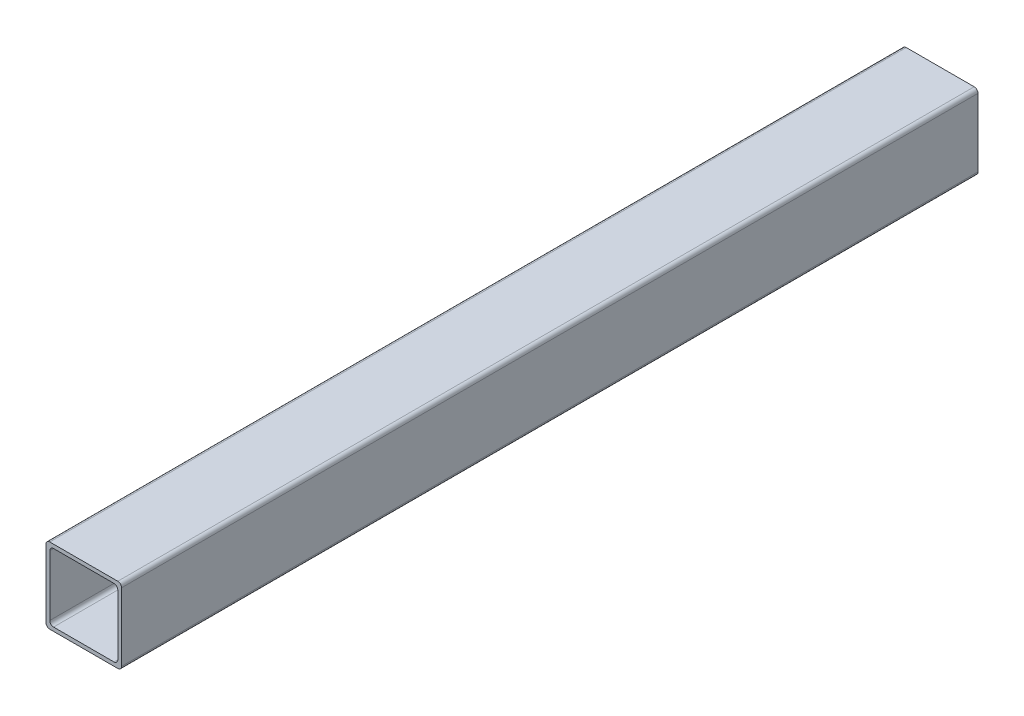
ISO-10303-21;
HEADER;
FILE_DESCRIPTION(('STEP AP214'),'2;1');
FILE_NAME('part.step','',(''),(''),'','','');
FILE_SCHEMA(('AUTOMOTIVE_DESIGN { 1 0 10303 214 1 1 1 1 }'));
ENDSEC;
DATA;
#1=APPLICATION_CONTEXT('core data for automotive mechanical design processes');
#2=APPLICATION_PROTOCOL_DEFINITION('international standard','automotive_design',2000,#1);
#3=PRODUCT_CONTEXT('',#1,'mechanical');
#4=PRODUCT('Part','Part','',(#3));
#5=PRODUCT_RELATED_PRODUCT_CATEGORY('part','',(#4));
#6=PRODUCT_DEFINITION_FORMATION('','',#4);
#7=PRODUCT_DEFINITION_CONTEXT('part definition',#1,'design');
#8=PRODUCT_DEFINITION('design','',#6,#7);
#9=PRODUCT_DEFINITION_SHAPE('','',#8);
#10=(LENGTH_UNIT() NAMED_UNIT(*) SI_UNIT(.MILLI.,.METRE.));
#11=(NAMED_UNIT(*) PLANE_ANGLE_UNIT() SI_UNIT($,.RADIAN.));
#12=(NAMED_UNIT(*) SI_UNIT($,.STERADIAN.) SOLID_ANGLE_UNIT());
#13=UNCERTAINTY_MEASURE_WITH_UNIT(LENGTH_MEASURE(1.E-05),#10,'distance_accuracy_value','');
#14=(GEOMETRIC_REPRESENTATION_CONTEXT(3) GLOBAL_UNCERTAINTY_ASSIGNED_CONTEXT((#13)) GLOBAL_UNIT_ASSIGNED_CONTEXT((#10,
#11,#12)) REPRESENTATION_CONTEXT('',''));
#15=CARTESIAN_POINT('',(0.,0.,0.));
#16=DIRECTION('',(0.,0.,1.));
#17=DIRECTION('',(1.,0.,0.));
#18=AXIS2_PLACEMENT_3D('',#15,#16,#17);
#19=CARTESIAN_POINT('',(3.,0.,680.));
#20=DIRECTION('',(-1.,0.,0.));
#21=DIRECTION('',(0.,0.,1.));
#22=AXIS2_PLACEMENT_3D('',#19,#20,#21);
#23=PLANE('',#22);
#24=DIRECTION('',(0.,1.,0.));
#25=VECTOR('',#24,1.);
#26=CARTESIAN_POINT('',(3.,0.,0.));
#27=LINE('',#26,#25);
#28=CARTESIAN_POINT('',(3.,6.00000000000002,0.));
#29=VERTEX_POINT('',#28);
#30=CARTESIAN_POINT('',(3.,54.,0.));
#31=VERTEX_POINT('',#30);
#32=EDGE_CURVE('E203',#29,#31,#27,.T.);
#33=ORIENTED_EDGE('',*,*,#32,.T.);
#34=DIRECTION('',(0.,0.,-1.));
#35=VECTOR('',#34,1.);
#36=CARTESIAN_POINT('',(3.,54.,680.));
#37=LINE('',#36,#35);
#38=CARTESIAN_POINT('',(3.,54.,680.));
#39=VERTEX_POINT('',#38);
#40=EDGE_CURVE('E11',#39,#31,#37,.T.);
#41=ORIENTED_EDGE('',*,*,#40,.F.);
#42=DIRECTION('',(0.,1.,0.));
#43=VECTOR('',#42,1.);
#44=CARTESIAN_POINT('',(3.,0.,680.));
#45=LINE('',#44,#43);
#46=CARTESIAN_POINT('',(3.,6.00000000000002,680.));
#47=VERTEX_POINT('',#46);
#48=EDGE_CURVE('E285',#47,#39,#45,.T.);
#49=ORIENTED_EDGE('',*,*,#48,.F.);
#50=DIRECTION('',(0.,0.,-1.));
#51=VECTOR('',#50,1.);
#52=CARTESIAN_POINT('',(3.,6.00000000000002,680.));
#53=LINE('',#52,#51);
#54=EDGE_CURVE('E51',#47,#29,#53,.T.);
#55=ORIENTED_EDGE('',*,*,#54,.T.);
#56=EDGE_LOOP('',(#33,#41,#49,#55));
#57=FACE_BOUND('',#56,.T.);
#58=ADVANCED_FACE('F32',(#57),#23,.F.);
#59=CARTESIAN_POINT('',(6.,54.,680.));
#60=DIRECTION('',(0.,0.,-1.));
#61=DIRECTION('',(-1.,0.,0.));
#62=AXIS2_PLACEMENT_3D('',#59,#60,#61);
#63=CYLINDRICAL_SURFACE('',#62,3.);
#64=CARTESIAN_POINT('',(6.,54.,0.));
#65=DIRECTION('',(0.,0.,1.));
#66=DIRECTION('',(1.,0.,0.));
#67=AXIS2_PLACEMENT_3D('',#64,#65,#66);
#68=CIRCLE('',#67,3.);
#69=CARTESIAN_POINT('',(6.00000000000002,57.,0.));
#70=VERTEX_POINT('',#69);
#71=EDGE_CURVE('E205',#31,#70,#68,.F.);
#72=ORIENTED_EDGE('',*,*,#71,.T.);
#73=DIRECTION('',(0.,0.,-1.));
#74=VECTOR('',#73,1.);
#75=CARTESIAN_POINT('',(6.00000000000002,57.,680.));
#76=LINE('',#75,#74);
#77=CARTESIAN_POINT('',(6.00000000000002,57.,680.));
#78=VERTEX_POINT('',#77);
#79=EDGE_CURVE('E42',#78,#70,#76,.T.);
#80=ORIENTED_EDGE('',*,*,#79,.F.);
#81=CARTESIAN_POINT('',(6.,54.,680.));
#82=DIRECTION('',(0.,0.,1.));
#83=DIRECTION('',(1.,0.,0.));
#84=AXIS2_PLACEMENT_3D('',#81,#82,#83);
#85=CIRCLE('',#84,3.);
#86=EDGE_CURVE('E287',#39,#78,#85,.F.);
#87=ORIENTED_EDGE('',*,*,#86,.F.);
#88=ORIENTED_EDGE('',*,*,#40,.T.);
#89=EDGE_LOOP('',(#72,#80,#87,#88));
#90=FACE_BOUND('',#89,.T.);
#91=ADVANCED_FACE('F312',(#90),#63,.F.);
#92=CARTESIAN_POINT('',(0.,57.,680.));
#93=DIRECTION('',(0.,1.,0.));
#94=DIRECTION('',(0.,0.,1.));
#95=AXIS2_PLACEMENT_3D('',#92,#93,#94);
#96=PLANE('',#95);
#97=DIRECTION('',(1.,0.,0.));
#98=VECTOR('',#97,1.);
#99=CARTESIAN_POINT('',(0.,57.,0.));
#100=LINE('',#99,#98);
#101=CARTESIAN_POINT('',(54.,57.,0.));
#102=VERTEX_POINT('',#101);
#103=EDGE_CURVE('E207',#70,#102,#100,.T.);
#104=ORIENTED_EDGE('',*,*,#103,.T.);
#105=DIRECTION('',(0.,0.,-1.));
#106=VECTOR('',#105,1.);
#107=CARTESIAN_POINT('',(54.,57.,680.));
#108=LINE('',#107,#106);
#109=CARTESIAN_POINT('',(54.,57.,680.));
#110=VERTEX_POINT('',#109);
#111=EDGE_CURVE('E227',#110,#102,#108,.T.);
#112=ORIENTED_EDGE('',*,*,#111,.F.);
#113=DIRECTION('',(1.,0.,0.));
#114=VECTOR('',#113,1.);
#115=CARTESIAN_POINT('',(0.,57.,680.));
#116=LINE('',#115,#114);
#117=EDGE_CURVE('E289',#78,#110,#116,.T.);
#118=ORIENTED_EDGE('',*,*,#117,.F.);
#119=ORIENTED_EDGE('',*,*,#79,.T.);
#120=EDGE_LOOP('',(#104,#112,#118,#119));
#121=FACE_BOUND('',#120,.T.);
#122=ADVANCED_FACE('F317',(#121),#96,.F.);
#123=CARTESIAN_POINT('',(54.,54.,680.));
#124=DIRECTION('',(0.,0.,-1.));
#125=DIRECTION('',(-1.,0.,0.));
#126=AXIS2_PLACEMENT_3D('',#123,#124,#125);
#127=CYLINDRICAL_SURFACE('',#126,3.);
#128=CARTESIAN_POINT('',(54.,54.,0.));
#129=DIRECTION('',(0.,0.,1.));
#130=DIRECTION('',(1.,0.,0.));
#131=AXIS2_PLACEMENT_3D('',#128,#129,#130);
#132=CIRCLE('',#131,3.);
#133=CARTESIAN_POINT('',(57.,54.,0.));
#134=VERTEX_POINT('',#133);
#135=EDGE_CURVE('E209',#102,#134,#132,.F.);
#136=ORIENTED_EDGE('',*,*,#135,.T.);
#137=DIRECTION('',(0.,0.,-1.));
#138=VECTOR('',#137,1.);
#139=CARTESIAN_POINT('',(57.,54.,680.));
#140=LINE('',#139,#138);
#141=CARTESIAN_POINT('',(57.,54.,680.));
#142=VERTEX_POINT('',#141);
#143=EDGE_CURVE('E225',#142,#134,#140,.T.);
#144=ORIENTED_EDGE('',*,*,#143,.F.);
#145=CARTESIAN_POINT('',(54.,54.,680.));
#146=DIRECTION('',(0.,0.,1.));
#147=DIRECTION('',(1.,0.,0.));
#148=AXIS2_PLACEMENT_3D('',#145,#146,#147);
#149=CIRCLE('',#148,3.);
#150=EDGE_CURVE('E291',#110,#142,#149,.F.);
#151=ORIENTED_EDGE('',*,*,#150,.F.);
#152=ORIENTED_EDGE('',*,*,#111,.T.);
#153=EDGE_LOOP('',(#136,#144,#151,#152));
#154=FACE_BOUND('',#153,.T.);
#155=ADVANCED_FACE('F350',(#154),#127,.F.);
#156=CARTESIAN_POINT('',(57.,0.,680.));
#157=DIRECTION('',(-1.,0.,0.));
#158=DIRECTION('',(0.,0.,1.));
#159=AXIS2_PLACEMENT_3D('',#156,#157,#158);
#160=PLANE('',#159);
#161=DIRECTION('',(0.,1.,0.));
#162=VECTOR('',#161,1.);
#163=CARTESIAN_POINT('',(57.,0.,0.));
#164=LINE('',#163,#162);
#165=CARTESIAN_POINT('',(57.,6.00000000000002,0.));
#166=VERTEX_POINT('',#165);
#167=EDGE_CURVE('E212',#166,#134,#164,.T.);
#168=ORIENTED_EDGE('',*,*,#167,.F.);
#169=DIRECTION('',(0.,0.,-1.));
#170=VECTOR('',#169,1.);
#171=CARTESIAN_POINT('',(57.,6.00000000000002,680.));
#172=LINE('',#171,#170);
#173=CARTESIAN_POINT('',(57.,6.00000000000002,680.));
#174=VERTEX_POINT('',#173);
#175=EDGE_CURVE('E172',#174,#166,#172,.T.);
#176=ORIENTED_EDGE('',*,*,#175,.F.);
#177=DIRECTION('',(0.,1.,0.));
#178=VECTOR('',#177,1.);
#179=CARTESIAN_POINT('',(57.,0.,680.));
#180=LINE('',#179,#178);
#181=EDGE_CURVE('E162',#174,#142,#180,.T.);
#182=ORIENTED_EDGE('',*,*,#181,.T.);
#183=ORIENTED_EDGE('',*,*,#143,.T.);
#184=EDGE_LOOP('',(#168,#176,#182,#183));
#185=FACE_BOUND('',#184,.T.);
#186=ADVANCED_FACE('F294',(#185),#160,.T.);
#187=CARTESIAN_POINT('',(54.,6.,680.));
#188=DIRECTION('',(0.,0.,-1.));
#189=DIRECTION('',(-1.,0.,0.));
#190=AXIS2_PLACEMENT_3D('',#187,#188,#189);
#191=CYLINDRICAL_SURFACE('',#190,3.);
#192=CARTESIAN_POINT('',(54.,6.,0.));
#193=DIRECTION('',(0.,0.,1.));
#194=DIRECTION('',(1.,0.,0.));
#195=AXIS2_PLACEMENT_3D('',#192,#193,#194);
#196=CIRCLE('',#195,3.);
#197=CARTESIAN_POINT('',(54.,3.,0.));
#198=VERTEX_POINT('',#197);
#199=EDGE_CURVE('E169',#166,#198,#196,.F.);
#200=ORIENTED_EDGE('',*,*,#199,.T.);
#201=DIRECTION('',(0.,0.,-1.));
#202=VECTOR('',#201,1.);
#203=CARTESIAN_POINT('',(54.,3.,680.));
#204=LINE('',#203,#202);
#205=CARTESIAN_POINT('',(54.,3.,680.));
#206=VERTEX_POINT('',#205);
#207=EDGE_CURVE('E166',#206,#198,#204,.T.);
#208=ORIENTED_EDGE('',*,*,#207,.F.);
#209=CARTESIAN_POINT('',(54.,6.,680.));
#210=DIRECTION('',(0.,0.,1.));
#211=DIRECTION('',(1.,0.,0.));
#212=AXIS2_PLACEMENT_3D('',#209,#210,#211);
#213=CIRCLE('',#212,3.);
#214=EDGE_CURVE('E154',#174,#206,#213,.F.);
#215=ORIENTED_EDGE('',*,*,#214,.F.);
#216=ORIENTED_EDGE('',*,*,#175,.T.);
#217=EDGE_LOOP('',(#200,#208,#215,#216));
#218=FACE_BOUND('',#217,.T.);
#219=ADVANCED_FACE('F167',(#218),#191,.F.);
#220=CARTESIAN_POINT('',(0.,3.,680.));
#221=DIRECTION('',(0.,1.,0.));
#222=DIRECTION('',(0.,0.,1.));
#223=AXIS2_PLACEMENT_3D('',#220,#221,#222);
#224=PLANE('',#223);
#225=DIRECTION('',(1.,0.,0.));
#226=VECTOR('',#225,1.);
#227=CARTESIAN_POINT('',(0.,3.,0.));
#228=LINE('',#227,#226);
#229=CARTESIAN_POINT('',(6.00000000000002,3.,0.));
#230=VERTEX_POINT('',#229);
#231=EDGE_CURVE('E216',#230,#198,#228,.T.);
#232=ORIENTED_EDGE('',*,*,#231,.F.);
#233=DIRECTION('',(0.,0.,-1.));
#234=VECTOR('',#233,1.);
#235=CARTESIAN_POINT('',(6.00000000000002,3.,680.));
#236=LINE('',#235,#234);
#237=CARTESIAN_POINT('',(6.00000000000002,3.,680.));
#238=VERTEX_POINT('',#237);
#239=EDGE_CURVE('E101',#238,#230,#236,.T.);
#240=ORIENTED_EDGE('',*,*,#239,.F.);
#241=DIRECTION('',(1.,0.,0.));
#242=VECTOR('',#241,1.);
#243=CARTESIAN_POINT('',(0.,3.,680.));
#244=LINE('',#243,#242);
#245=EDGE_CURVE('E160',#238,#206,#244,.T.);
#246=ORIENTED_EDGE('',*,*,#245,.T.);
#247=ORIENTED_EDGE('',*,*,#207,.T.);
#248=EDGE_LOOP('',(#232,#240,#246,#247));
#249=FACE_BOUND('',#248,.T.);
#250=ADVANCED_FACE('F174',(#249),#224,.T.);
#251=CARTESIAN_POINT('',(3.,57.,680.));
#252=DIRECTION('',(0.,0.,-1.));
#253=DIRECTION('',(-1.,0.,0.));
#254=AXIS2_PLACEMENT_3D('',#251,#252,#253);
#255=CYLINDRICAL_SURFACE('',#254,3.);
#256=CARTESIAN_POINT('',(3.,57.,0.));
#257=DIRECTION('',(0.,0.,1.));
#258=DIRECTION('',(1.,0.,0.));
#259=AXIS2_PLACEMENT_3D('',#256,#257,#258);
#260=CIRCLE('',#259,3.);
#261=CARTESIAN_POINT('',(0.,57.,0.));
#262=VERTEX_POINT('',#261);
#263=CARTESIAN_POINT('',(3.00000000000002,60.,0.));
#264=VERTEX_POINT('',#263);
#265=EDGE_CURVE('E181',#262,#264,#260,.F.);
#266=ORIENTED_EDGE('',*,*,#265,.F.);
#267=DIRECTION('',(0.,0.,-1.));
#268=VECTOR('',#267,1.);
#269=CARTESIAN_POINT('',(0.,57.,680.));
#270=LINE('',#269,#268);
#271=CARTESIAN_POINT('',(0.,57.,680.));
#272=VERTEX_POINT('',#271);
#273=EDGE_CURVE('E36',#272,#262,#270,.T.);
#274=ORIENTED_EDGE('',*,*,#273,.F.);
#275=CARTESIAN_POINT('',(3.,57.,680.));
#276=DIRECTION('',(0.,0.,1.));
#277=DIRECTION('',(1.,0.,0.));
#278=AXIS2_PLACEMENT_3D('',#275,#276,#277);
#279=CIRCLE('',#278,3.);
#280=CARTESIAN_POINT('',(3.00000000000002,60.,680.));
#281=VERTEX_POINT('',#280);
#282=EDGE_CURVE('E221',#272,#281,#279,.F.);
#283=ORIENTED_EDGE('',*,*,#282,.T.);
#284=DIRECTION('',(0.,0.,-1.));
#285=VECTOR('',#284,1.);
#286=CARTESIAN_POINT('',(3.00000000000002,60.,680.));
#287=LINE('',#286,#285);
#288=EDGE_CURVE('E177',#281,#264,#287,.T.);
#289=ORIENTED_EDGE('',*,*,#288,.T.);
#290=EDGE_LOOP('',(#266,#274,#283,#289));
#291=FACE_BOUND('',#290,.T.);
#292=ADVANCED_FACE('F34',(#291),#255,.T.);
#293=CARTESIAN_POINT('',(0.,0.,680.));
#294=DIRECTION('',(-1.,0.,0.));
#295=DIRECTION('',(0.,0.,1.));
#296=AXIS2_PLACEMENT_3D('',#293,#294,#295);
#297=PLANE('',#296);
#298=DIRECTION('',(0.,1.,0.));
#299=VECTOR('',#298,1.);
#300=CARTESIAN_POINT('',(0.,0.,0.));
#301=LINE('',#300,#299);
#302=CARTESIAN_POINT('',(0.,3.00000000000002,0.));
#303=VERTEX_POINT('',#302);
#304=EDGE_CURVE('E184',#303,#262,#301,.T.);
#305=ORIENTED_EDGE('',*,*,#304,.F.);
#306=DIRECTION('',(0.,0.,-1.));
#307=VECTOR('',#306,1.);
#308=CARTESIAN_POINT('',(0.,3.00000000000002,680.));
#309=LINE('',#308,#307);
#310=CARTESIAN_POINT('',(0.,3.00000000000002,680.));
#311=VERTEX_POINT('',#310);
#312=EDGE_CURVE('E244',#311,#303,#309,.T.);
#313=ORIENTED_EDGE('',*,*,#312,.F.);
#314=DIRECTION('',(0.,1.,0.));
#315=VECTOR('',#314,1.);
#316=CARTESIAN_POINT('',(0.,0.,680.));
#317=LINE('',#316,#315);
#318=EDGE_CURVE('E253',#311,#272,#317,.T.);
#319=ORIENTED_EDGE('',*,*,#318,.T.);
#320=ORIENTED_EDGE('',*,*,#273,.T.);
#321=EDGE_LOOP('',(#305,#313,#319,#320));
#322=FACE_BOUND('',#321,.T.);
#323=ADVANCED_FACE('F251',(#322),#297,.T.);
#324=CARTESIAN_POINT('',(3.,3.,680.));
#325=DIRECTION('',(0.,0.,-1.));
#326=DIRECTION('',(-1.,0.,0.));
#327=AXIS2_PLACEMENT_3D('',#324,#325,#326);
#328=CYLINDRICAL_SURFACE('',#327,3.);
#329=CARTESIAN_POINT('',(3.,3.,0.));
#330=DIRECTION('',(0.,0.,1.));
#331=DIRECTION('',(1.,0.,0.));
#332=AXIS2_PLACEMENT_3D('',#329,#330,#331);
#333=CIRCLE('',#332,3.);
#334=CARTESIAN_POINT('',(3.00000000000002,0.,0.));
#335=VERTEX_POINT('',#334);
#336=EDGE_CURVE('E187',#335,#303,#333,.F.);
#337=ORIENTED_EDGE('',*,*,#336,.F.);
#338=DIRECTION('',(0.,0.,-1.));
#339=VECTOR('',#338,1.);
#340=CARTESIAN_POINT('',(3.00000000000002,0.,680.));
#341=LINE('',#340,#339);
#342=CARTESIAN_POINT('',(3.00000000000002,0.,680.));
#343=VERTEX_POINT('',#342);
#344=EDGE_CURVE('E243',#343,#335,#341,.T.);
#345=ORIENTED_EDGE('',*,*,#344,.F.);
#346=CARTESIAN_POINT('',(3.,3.,680.));
#347=DIRECTION('',(0.,0.,1.));
#348=DIRECTION('',(1.,0.,0.));
#349=AXIS2_PLACEMENT_3D('',#346,#347,#348);
#350=CIRCLE('',#349,3.);
#351=EDGE_CURVE('E263',#343,#311,#350,.F.);
#352=ORIENTED_EDGE('',*,*,#351,.T.);
#353=ORIENTED_EDGE('',*,*,#312,.T.);
#354=EDGE_LOOP('',(#337,#345,#352,#353));
#355=FACE_BOUND('',#354,.T.);
#356=ADVANCED_FACE('F260',(#355),#328,.T.);
#357=CARTESIAN_POINT('',(0.,0.,680.));
#358=DIRECTION('',(0.,1.,0.));
#359=DIRECTION('',(0.,0.,1.));
#360=AXIS2_PLACEMENT_3D('',#357,#358,#359);
#361=PLANE('',#360);
#362=DIRECTION('',(1.,0.,0.));
#363=VECTOR('',#362,1.);
#364=CARTESIAN_POINT('',(0.,0.,0.));
#365=LINE('',#364,#363);
#366=CARTESIAN_POINT('',(57.,0.,0.));
#367=VERTEX_POINT('',#366);
#368=EDGE_CURVE('E190',#335,#367,#365,.T.);
#369=ORIENTED_EDGE('',*,*,#368,.T.);
#370=DIRECTION('',(0.,0.,-1.));
#371=VECTOR('',#370,1.);
#372=CARTESIAN_POINT('',(57.,0.,680.));
#373=LINE('',#372,#371);
#374=CARTESIAN_POINT('',(57.,0.,680.));
#375=VERTEX_POINT('',#374);
#376=EDGE_CURVE('E240',#375,#367,#373,.T.);
#377=ORIENTED_EDGE('',*,*,#376,.F.);
#378=DIRECTION('',(1.,0.,0.));
#379=VECTOR('',#378,1.);
#380=CARTESIAN_POINT('',(0.,0.,680.));
#381=LINE('',#380,#379);
#382=EDGE_CURVE('E266',#343,#375,#381,.T.);
#383=ORIENTED_EDGE('',*,*,#382,.F.);
#384=ORIENTED_EDGE('',*,*,#344,.T.);
#385=EDGE_LOOP('',(#369,#377,#383,#384));
#386=FACE_BOUND('',#385,.T.);
#387=ADVANCED_FACE('F267',(#386),#361,.F.);
#388=CARTESIAN_POINT('',(57.,3.,680.));
#389=DIRECTION('',(0.,0.,-1.));
#390=DIRECTION('',(-1.,0.,0.));
#391=AXIS2_PLACEMENT_3D('',#388,#389,#390);
#392=CYLINDRICAL_SURFACE('',#391,3.);
#393=CARTESIAN_POINT('',(57.,3.,0.));
#394=DIRECTION('',(0.,0.,1.));
#395=DIRECTION('',(1.,0.,0.));
#396=AXIS2_PLACEMENT_3D('',#393,#394,#395);
#397=CIRCLE('',#396,3.);
#398=CARTESIAN_POINT('',(60.,3.00000000000002,0.));
#399=VERTEX_POINT('',#398);
#400=EDGE_CURVE('E192',#367,#399,#397,.T.);
#401=ORIENTED_EDGE('',*,*,#400,.T.);
#402=DIRECTION('',(0.,0.,-1.));
#403=VECTOR('',#402,1.);
#404=CARTESIAN_POINT('',(60.,3.00000000000002,680.));
#405=LINE('',#404,#403);
#406=CARTESIAN_POINT('',(60.,3.00000000000002,680.));
#407=VERTEX_POINT('',#406);
#408=EDGE_CURVE('E237',#407,#399,#405,.T.);
#409=ORIENTED_EDGE('',*,*,#408,.F.);
#410=CARTESIAN_POINT('',(57.,3.,680.));
#411=DIRECTION('',(0.,0.,1.));
#412=DIRECTION('',(1.,0.,0.));
#413=AXIS2_PLACEMENT_3D('',#410,#411,#412);
#414=CIRCLE('',#413,3.);
#415=EDGE_CURVE('E270',#375,#407,#414,.T.);
#416=ORIENTED_EDGE('',*,*,#415,.F.);
#417=ORIENTED_EDGE('',*,*,#376,.T.);
#418=EDGE_LOOP('',(#401,#409,#416,#417));
#419=FACE_BOUND('',#418,.T.);
#420=ADVANCED_FACE('F328',(#419),#392,.T.);
#421=CARTESIAN_POINT('',(60.,0.,680.));
#422=DIRECTION('',(-1.,0.,0.));
#423=DIRECTION('',(0.,0.,1.));
#424=AXIS2_PLACEMENT_3D('',#421,#422,#423);
#425=PLANE('',#424);
#426=DIRECTION('',(0.,1.,0.));
#427=VECTOR('',#426,1.);
#428=CARTESIAN_POINT('',(60.,0.,0.));
#429=LINE('',#428,#427);
#430=CARTESIAN_POINT('',(60.,57.,0.));
#431=VERTEX_POINT('',#430);
#432=EDGE_CURVE('E194',#399,#431,#429,.T.);
#433=ORIENTED_EDGE('',*,*,#432,.T.);
#434=DIRECTION('',(0.,0.,-1.));
#435=VECTOR('',#434,1.);
#436=CARTESIAN_POINT('',(60.,57.,680.));
#437=LINE('',#436,#435);
#438=CARTESIAN_POINT('',(60.,57.,680.));
#439=VERTEX_POINT('',#438);
#440=EDGE_CURVE('E235',#439,#431,#437,.T.);
#441=ORIENTED_EDGE('',*,*,#440,.F.);
#442=DIRECTION('',(0.,1.,0.));
#443=VECTOR('',#442,1.);
#444=CARTESIAN_POINT('',(60.,0.,680.));
#445=LINE('',#444,#443);
#446=EDGE_CURVE('E277',#407,#439,#445,.T.);
#447=ORIENTED_EDGE('',*,*,#446,.F.);
#448=ORIENTED_EDGE('',*,*,#408,.T.);
#449=EDGE_LOOP('',(#433,#441,#447,#448));
#450=FACE_BOUND('',#449,.T.);
#451=ADVANCED_FACE('F324',(#450),#425,.F.);
#452=CARTESIAN_POINT('',(57.,57.,680.));
#453=DIRECTION('',(0.,0.,-1.));
#454=DIRECTION('',(-1.,0.,0.));
#455=AXIS2_PLACEMENT_3D('',#452,#453,#454);
#456=CYLINDRICAL_SURFACE('',#455,3.);
#457=CARTESIAN_POINT('',(57.,57.,0.));
#458=DIRECTION('',(0.,0.,1.));
#459=DIRECTION('',(1.,0.,0.));
#460=AXIS2_PLACEMENT_3D('',#457,#458,#459);
#461=CIRCLE('',#460,3.);
#462=CARTESIAN_POINT('',(57.,60.,0.));
#463=VERTEX_POINT('',#462);
#464=EDGE_CURVE('E197',#463,#431,#461,.F.);
#465=ORIENTED_EDGE('',*,*,#464,.F.);
#466=DIRECTION('',(0.,0.,-1.));
#467=VECTOR('',#466,1.);
#468=CARTESIAN_POINT('',(57.,60.,680.));
#469=LINE('',#468,#467);
#470=CARTESIAN_POINT('',(57.,60.,680.));
#471=VERTEX_POINT('',#470);
#472=EDGE_CURVE('E233',#471,#463,#469,.T.);
#473=ORIENTED_EDGE('',*,*,#472,.F.);
#474=CARTESIAN_POINT('',(57.,57.,680.));
#475=DIRECTION('',(0.,0.,1.));
#476=DIRECTION('',(1.,0.,0.));
#477=AXIS2_PLACEMENT_3D('',#474,#475,#476);
#478=CIRCLE('',#477,3.);
#479=EDGE_CURVE('E279',#471,#439,#478,.F.);
#480=ORIENTED_EDGE('',*,*,#479,.T.);
#481=ORIENTED_EDGE('',*,*,#440,.T.);
#482=EDGE_LOOP('',(#465,#473,#480,#481));
#483=FACE_BOUND('',#482,.T.);
#484=ADVANCED_FACE('F306',(#483),#456,.T.);
#485=CARTESIAN_POINT('',(0.,60.,680.));
#486=DIRECTION('',(0.,1.,0.));
#487=DIRECTION('',(0.,0.,1.));
#488=AXIS2_PLACEMENT_3D('',#485,#486,#487);
#489=PLANE('',#488);
#490=DIRECTION('',(1.,0.,0.));
#491=VECTOR('',#490,1.);
#492=CARTESIAN_POINT('',(0.,60.,0.));
#493=LINE('',#492,#491);
#494=EDGE_CURVE('E200',#264,#463,#493,.T.);
#495=ORIENTED_EDGE('',*,*,#494,.F.);
#496=ORIENTED_EDGE('',*,*,#288,.F.);
#497=DIRECTION('',(1.,0.,0.));
#498=VECTOR('',#497,1.);
#499=CARTESIAN_POINT('',(0.,60.,680.));
#500=LINE('',#499,#498);
#501=EDGE_CURVE('E282',#281,#471,#500,.T.);
#502=ORIENTED_EDGE('',*,*,#501,.T.);
#503=ORIENTED_EDGE('',*,*,#472,.T.);
#504=EDGE_LOOP('',(#495,#496,#502,#503));
#505=FACE_BOUND('',#504,.T.);
#506=ADVANCED_FACE('F299',(#505),#489,.T.);
#507=CARTESIAN_POINT('',(6.,6.,680.));
#508=DIRECTION('',(0.,0.,-1.));
#509=DIRECTION('',(-1.,0.,0.));
#510=AXIS2_PLACEMENT_3D('',#507,#508,#509);
#511=CYLINDRICAL_SURFACE('',#510,3.);
#512=CARTESIAN_POINT('',(6.,6.,0.));
#513=DIRECTION('',(0.,0.,1.));
#514=DIRECTION('',(1.,0.,0.));
#515=AXIS2_PLACEMENT_3D('',#512,#513,#514);
#516=CIRCLE('',#515,3.);
#517=EDGE_CURVE('E218',#29,#230,#516,.T.);
#518=ORIENTED_EDGE('',*,*,#517,.F.);
#519=ORIENTED_EDGE('',*,*,#54,.F.);
#520=CARTESIAN_POINT('',(6.,6.,680.));
#521=DIRECTION('',(0.,0.,1.));
#522=DIRECTION('',(1.,0.,0.));
#523=AXIS2_PLACEMENT_3D('',#520,#521,#522);
#524=CIRCLE('',#523,3.);
#525=EDGE_CURVE('E175',#47,#238,#524,.T.);
#526=ORIENTED_EDGE('',*,*,#525,.T.);
#527=ORIENTED_EDGE('',*,*,#239,.T.);
#528=EDGE_LOOP('',(#518,#519,#526,#527));
#529=FACE_BOUND('',#528,.T.);
#530=ADVANCED_FACE('F297',(#529),#511,.F.);
#531=CARTESIAN_POINT('',(0.,0.,680.));
#532=DIRECTION('',(0.,0.,1.));
#533=DIRECTION('',(1.,0.,0.));
#534=AXIS2_PLACEMENT_3D('',#531,#532,#533);
#535=PLANE('',#534);
#536=ORIENTED_EDGE('',*,*,#282,.F.);
#537=ORIENTED_EDGE('',*,*,#318,.F.);
#538=ORIENTED_EDGE('',*,*,#351,.F.);
#539=ORIENTED_EDGE('',*,*,#382,.T.);
#540=ORIENTED_EDGE('',*,*,#415,.T.);
#541=ORIENTED_EDGE('',*,*,#446,.T.);
#542=ORIENTED_EDGE('',*,*,#479,.F.);
#543=ORIENTED_EDGE('',*,*,#501,.F.);
#544=EDGE_LOOP('',(#536,#537,#538,#539,#540,#541,#542,#543));
#545=FACE_BOUND('',#544,.T.);
#546=ORIENTED_EDGE('',*,*,#48,.T.);
#547=ORIENTED_EDGE('',*,*,#86,.T.);
#548=ORIENTED_EDGE('',*,*,#117,.T.);
#549=ORIENTED_EDGE('',*,*,#150,.T.);
#550=ORIENTED_EDGE('',*,*,#181,.F.);
#551=ORIENTED_EDGE('',*,*,#214,.T.);
#552=ORIENTED_EDGE('',*,*,#245,.F.);
#553=ORIENTED_EDGE('',*,*,#525,.F.);
#554=EDGE_LOOP('',(#546,#547,#548,#549,#550,#551,#552,#553));
#555=FACE_BOUND('',#554,.T.);
#556=ADVANCED_FACE('F157',(#545,#555),#535,.T.);
#557=CARTESIAN_POINT('',(0.,0.,0.));
#558=DIRECTION('',(0.,0.,1.));
#559=DIRECTION('',(1.,0.,0.));
#560=AXIS2_PLACEMENT_3D('',#557,#558,#559);
#561=PLANE('',#560);
#562=ORIENTED_EDGE('',*,*,#265,.T.);
#563=ORIENTED_EDGE('',*,*,#494,.T.);
#564=ORIENTED_EDGE('',*,*,#464,.T.);
#565=ORIENTED_EDGE('',*,*,#432,.F.);
#566=ORIENTED_EDGE('',*,*,#400,.F.);
#567=ORIENTED_EDGE('',*,*,#368,.F.);
#568=ORIENTED_EDGE('',*,*,#336,.T.);
#569=ORIENTED_EDGE('',*,*,#304,.T.);
#570=EDGE_LOOP('',(#562,#563,#564,#565,#566,#567,#568,#569));
#571=FACE_BOUND('',#570,.T.);
#572=ORIENTED_EDGE('',*,*,#32,.F.);
#573=ORIENTED_EDGE('',*,*,#517,.T.);
#574=ORIENTED_EDGE('',*,*,#231,.T.);
#575=ORIENTED_EDGE('',*,*,#199,.F.);
#576=ORIENTED_EDGE('',*,*,#167,.T.);
#577=ORIENTED_EDGE('',*,*,#135,.F.);
#578=ORIENTED_EDGE('',*,*,#103,.F.);
#579=ORIENTED_EDGE('',*,*,#71,.F.);
#580=EDGE_LOOP('',(#572,#573,#574,#575,#576,#577,#578,#579));
#581=FACE_BOUND('',#580,.T.);
#582=ADVANCED_FACE('F256',(#571,#581),#561,.F.);
#583=CLOSED_SHELL('',(#58,#91,#122,#155,#186,#219,#250,#292,#323,#356,#387,#420,#451,#484,#506,
#530,#556,#582));
#584=MANIFOLD_SOLID_BREP('B2',#583);
#585=ADVANCED_BREP_SHAPE_REPRESENTATION('',(#18,#584),#14);
#586=SHAPE_DEFINITION_REPRESENTATION(#9,#585);
ENDSEC;
END-ISO-10303-21;
